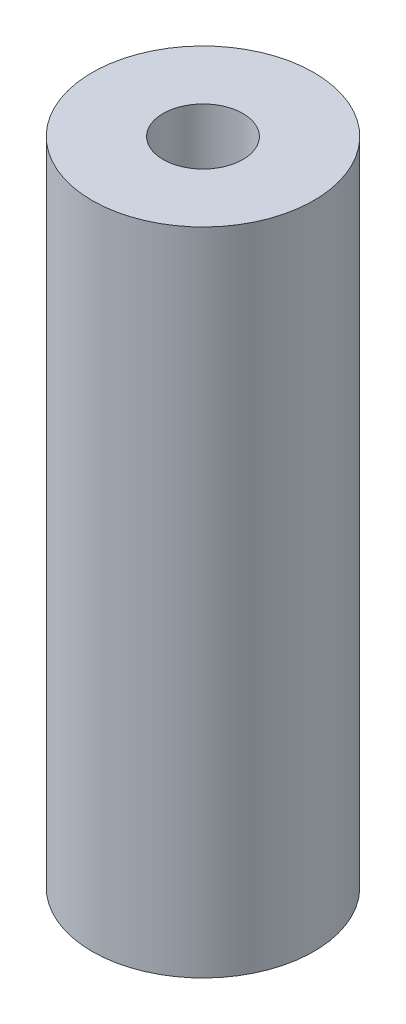
ISO-10303-21;
HEADER;
FILE_DESCRIPTION(('STEP AP214'),'2;1');
FILE_NAME('part.step','',(''),(''),'','','');
FILE_SCHEMA(('AUTOMOTIVE_DESIGN { 1 0 10303 214 1 1 1 1 }'));
ENDSEC;
DATA;
#1=APPLICATION_CONTEXT('core data for automotive mechanical design processes');
#2=APPLICATION_PROTOCOL_DEFINITION('international standard','automotive_design',2000,#1);
#3=PRODUCT_CONTEXT('',#1,'mechanical');
#4=PRODUCT('Part','Part','',(#3));
#5=PRODUCT_RELATED_PRODUCT_CATEGORY('part','',(#4));
#6=PRODUCT_DEFINITION_FORMATION('','',#4);
#7=PRODUCT_DEFINITION_CONTEXT('part definition',#1,'design');
#8=PRODUCT_DEFINITION('design','',#6,#7);
#9=PRODUCT_DEFINITION_SHAPE('','',#8);
#10=(LENGTH_UNIT() NAMED_UNIT(*) SI_UNIT(.MILLI.,.METRE.));
#11=(NAMED_UNIT(*) PLANE_ANGLE_UNIT() SI_UNIT($,.RADIAN.));
#12=(NAMED_UNIT(*) SI_UNIT($,.STERADIAN.) SOLID_ANGLE_UNIT());
#13=UNCERTAINTY_MEASURE_WITH_UNIT(LENGTH_MEASURE(1.E-05),#10,'distance_accuracy_value','');
#14=(GEOMETRIC_REPRESENTATION_CONTEXT(3) GLOBAL_UNCERTAINTY_ASSIGNED_CONTEXT((#13)) GLOBAL_UNIT_ASSIGNED_CONTEXT((#10,
#11,#12)) REPRESENTATION_CONTEXT('',''));
#15=CARTESIAN_POINT('',(0.,0.,0.));
#16=DIRECTION('',(0.,0.,1.));
#17=DIRECTION('',(1.,0.,0.));
#18=AXIS2_PLACEMENT_3D('',#15,#16,#17);
#19=CARTESIAN_POINT('',(0.,22.,0.));
#20=DIRECTION('',(0.,-1.,0.));
#21=DIRECTION('',(0.,0.,-1.));
#22=AXIS2_PLACEMENT_3D('',#19,#20,#21);
#23=CYLINDRICAL_SURFACE('',#22,3.75);
#24=CARTESIAN_POINT('',(0.,22.,0.));
#25=DIRECTION('',(0.,1.,0.));
#26=DIRECTION('',(0.,0.,1.));
#27=AXIS2_PLACEMENT_3D('',#24,#25,#26);
#28=CIRCLE('',#27,3.75);
#29=CARTESIAN_POINT('',(0.,22.,3.75));
#30=VERTEX_POINT('',#29);
#31=EDGE_CURVE('E10',#30,#30,#28,.T.);
#32=ORIENTED_EDGE('',*,*,#31,.F.);
#33=EDGE_LOOP('',(#32));
#34=FACE_BOUND('',#33,.T.);
#35=CARTESIAN_POINT('',(0.,0.,0.));
#36=DIRECTION('',(0.,1.,0.));
#37=DIRECTION('',(0.,0.,1.));
#38=AXIS2_PLACEMENT_3D('',#35,#36,#37);
#39=CIRCLE('',#38,3.75);
#40=CARTESIAN_POINT('',(0.,0.,3.75));
#41=VERTEX_POINT('',#40);
#42=EDGE_CURVE('E34',#41,#41,#39,.T.);
#43=ORIENTED_EDGE('',*,*,#42,.T.);
#44=EDGE_LOOP('',(#43));
#45=FACE_BOUND('',#44,.T.);
#46=ADVANCED_FACE('F31',(#34,#45),#23,.T.);
#47=CARTESIAN_POINT('',(0.,22.,0.));
#48=DIRECTION('',(0.,1.,0.));
#49=DIRECTION('',(0.,0.,1.));
#50=AXIS2_PLACEMENT_3D('',#47,#48,#49);
#51=PLANE('',#50);
#52=CARTESIAN_POINT('',(0.,22.,0.));
#53=DIRECTION('',(0.,-1.,0.));
#54=DIRECTION('',(0.,0.,-1.));
#55=AXIS2_PLACEMENT_3D('',#52,#53,#54);
#56=CIRCLE('',#55,1.35);
#57=CARTESIAN_POINT('',(0.,22.,-1.35));
#58=VERTEX_POINT('',#57);
#59=EDGE_CURVE('E41',#58,#58,#56,.T.);
#60=ORIENTED_EDGE('',*,*,#59,.T.);
#61=EDGE_LOOP('',(#60));
#62=FACE_BOUND('',#61,.T.);
#63=ORIENTED_EDGE('',*,*,#31,.T.);
#64=EDGE_LOOP('',(#63));
#65=FACE_BOUND('',#64,.T.);
#66=ADVANCED_FACE('F49',(#62,#65),#51,.T.);
#67=CARTESIAN_POINT('',(0.,0.,0.));
#68=DIRECTION('',(0.,1.,0.));
#69=DIRECTION('',(0.,0.,1.));
#70=AXIS2_PLACEMENT_3D('',#67,#68,#69);
#71=PLANE('',#70);
#72=CARTESIAN_POINT('',(0.,0.,0.));
#73=DIRECTION('',(0.,-1.,0.));
#74=DIRECTION('',(0.,0.,-1.));
#75=AXIS2_PLACEMENT_3D('',#72,#73,#74);
#76=CIRCLE('',#75,1.35);
#77=CARTESIAN_POINT('',(0.,0.,-1.35));
#78=VERTEX_POINT('',#77);
#79=EDGE_CURVE('E43',#78,#78,#76,.T.);
#80=ORIENTED_EDGE('',*,*,#79,.F.);
#81=EDGE_LOOP('',(#80));
#82=FACE_BOUND('',#81,.T.);
#83=ORIENTED_EDGE('',*,*,#42,.F.);
#84=EDGE_LOOP('',(#83));
#85=FACE_BOUND('',#84,.T.);
#86=ADVANCED_FACE('F54',(#82,#85),#71,.F.);
#87=CARTESIAN_POINT('',(0.,22.,0.));
#88=DIRECTION('',(0.,-1.,0.));
#89=DIRECTION('',(0.,0.,-1.));
#90=AXIS2_PLACEMENT_3D('',#87,#88,#89);
#91=CYLINDRICAL_SURFACE('',#90,1.35);
#92=ORIENTED_EDGE('',*,*,#59,.F.);
#93=EDGE_LOOP('',(#92));
#94=FACE_BOUND('',#93,.T.);
#95=ORIENTED_EDGE('',*,*,#79,.T.);
#96=EDGE_LOOP('',(#95));
#97=FACE_BOUND('',#96,.T.);
#98=ADVANCED_FACE('F51',(#94,#97),#91,.F.);
#99=CLOSED_SHELL('',(#46,#66,#86,#98));
#100=MANIFOLD_SOLID_BREP('B2',#99);
#101=ADVANCED_BREP_SHAPE_REPRESENTATION('',(#18,#100),#14);
#102=SHAPE_DEFINITION_REPRESENTATION(#9,#101);
ENDSEC;
END-ISO-10303-21;
